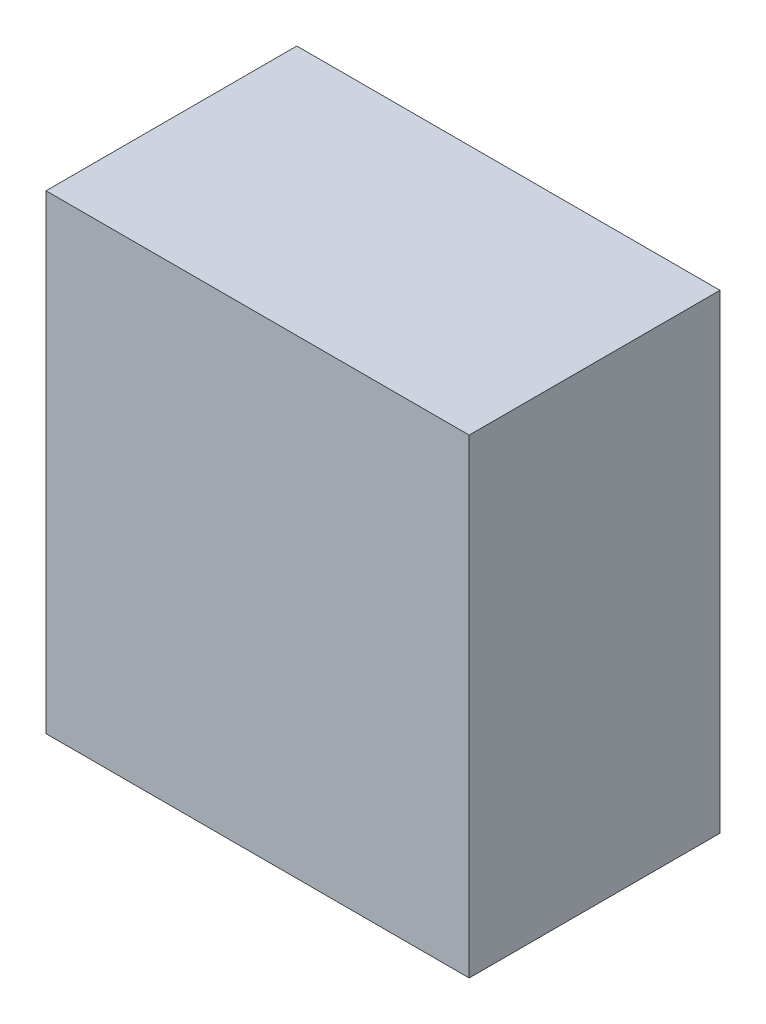
ISO-10303-21;
HEADER;
FILE_DESCRIPTION(('STEP AP214'),'2;1');
FILE_NAME('part.step','',(''),(''),'','','');
FILE_SCHEMA(('AUTOMOTIVE_DESIGN { 1 0 10303 214 1 1 1 1 }'));
ENDSEC;
DATA;
#1=APPLICATION_CONTEXT('core data for automotive mechanical design processes');
#2=APPLICATION_PROTOCOL_DEFINITION('international standard','automotive_design',2000,#1);
#3=PRODUCT_CONTEXT('',#1,'mechanical');
#4=PRODUCT('Part','Part','',(#3));
#5=PRODUCT_RELATED_PRODUCT_CATEGORY('part','',(#4));
#6=PRODUCT_DEFINITION_FORMATION('','',#4);
#7=PRODUCT_DEFINITION_CONTEXT('part definition',#1,'design');
#8=PRODUCT_DEFINITION('design','',#6,#7);
#9=PRODUCT_DEFINITION_SHAPE('','',#8);
#10=(LENGTH_UNIT() NAMED_UNIT(*) SI_UNIT(.MILLI.,.METRE.));
#11=(NAMED_UNIT(*) PLANE_ANGLE_UNIT() SI_UNIT($,.RADIAN.));
#12=(NAMED_UNIT(*) SI_UNIT($,.STERADIAN.) SOLID_ANGLE_UNIT());
#13=UNCERTAINTY_MEASURE_WITH_UNIT(LENGTH_MEASURE(1.E-05),#10,'distance_accuracy_value','');
#14=(GEOMETRIC_REPRESENTATION_CONTEXT(3) GLOBAL_UNCERTAINTY_ASSIGNED_CONTEXT((#13)) GLOBAL_UNIT_ASSIGNED_CONTEXT((#10,
#11,#12)) REPRESENTATION_CONTEXT('',''));
#15=CARTESIAN_POINT('',(0.,0.,0.));
#16=DIRECTION('',(0.,0.,1.));
#17=DIRECTION('',(1.,0.,0.));
#18=AXIS2_PLACEMENT_3D('',#15,#16,#17);
#19=CARTESIAN_POINT('',(2.7,6.,1.6));
#20=DIRECTION('',(-1.,0.,0.));
#21=DIRECTION('',(0.,0.,1.));
#22=AXIS2_PLACEMENT_3D('',#19,#20,#21);
#23=PLANE('',#22);
#24=DIRECTION('',(0.,0.,-1.));
#25=VECTOR('',#24,1.);
#26=CARTESIAN_POINT('',(2.7,0.,1.6));
#27=LINE('',#26,#25);
#28=CARTESIAN_POINT('',(2.7,0.,1.6));
#29=VERTEX_POINT('',#28);
#30=CARTESIAN_POINT('',(2.7,0.,-1.6));
#31=VERTEX_POINT('',#30);
#32=EDGE_CURVE('E97',#29,#31,#27,.T.);
#33=ORIENTED_EDGE('',*,*,#32,.T.);
#34=DIRECTION('',(0.,-1.,0.));
#35=VECTOR('',#34,1.);
#36=CARTESIAN_POINT('',(2.7,6.,-1.6));
#37=LINE('',#36,#35);
#38=CARTESIAN_POINT('',(2.7,6.,-1.6));
#39=VERTEX_POINT('',#38);
#40=EDGE_CURVE('E11',#39,#31,#37,.T.);
#41=ORIENTED_EDGE('',*,*,#40,.F.);
#42=DIRECTION('',(0.,0.,-1.));
#43=VECTOR('',#42,1.);
#44=CARTESIAN_POINT('',(2.7,6.,1.6));
#45=LINE('',#44,#43);
#46=CARTESIAN_POINT('',(2.7,6.,1.6));
#47=VERTEX_POINT('',#46);
#48=EDGE_CURVE('E85',#47,#39,#45,.T.);
#49=ORIENTED_EDGE('',*,*,#48,.F.);
#50=DIRECTION('',(0.,-1.,0.));
#51=VECTOR('',#50,1.);
#52=CARTESIAN_POINT('',(2.7,6.,1.6));
#53=LINE('',#52,#51);
#54=EDGE_CURVE('E93',#47,#29,#53,.T.);
#55=ORIENTED_EDGE('',*,*,#54,.T.);
#56=EDGE_LOOP('',(#33,#41,#49,#55));
#57=FACE_BOUND('',#56,.T.);
#58=ADVANCED_FACE('F34',(#57),#23,.F.);
#59=CARTESIAN_POINT('',(-2.7,6.,-1.6));
#60=DIRECTION('',(0.,0.,1.));
#61=DIRECTION('',(1.,0.,0.));
#62=AXIS2_PLACEMENT_3D('',#59,#60,#61);
#63=PLANE('',#62);
#64=DIRECTION('',(-1.,0.,0.));
#65=VECTOR('',#64,1.);
#66=CARTESIAN_POINT('',(-2.7,0.,-1.6));
#67=LINE('',#66,#65);
#68=CARTESIAN_POINT('',(-2.7,0.,-1.6));
#69=VERTEX_POINT('',#68);
#70=EDGE_CURVE('E89',#31,#69,#67,.T.);
#71=ORIENTED_EDGE('',*,*,#70,.T.);
#72=DIRECTION('',(0.,-1.,0.));
#73=VECTOR('',#72,1.);
#74=CARTESIAN_POINT('',(-2.7,6.,-1.6));
#75=LINE('',#74,#73);
#76=CARTESIAN_POINT('',(-2.7,6.,-1.6));
#77=VERTEX_POINT('',#76);
#78=EDGE_CURVE('E42',#77,#69,#75,.T.);
#79=ORIENTED_EDGE('',*,*,#78,.F.);
#80=DIRECTION('',(-1.,0.,0.));
#81=VECTOR('',#80,1.);
#82=CARTESIAN_POINT('',(-2.7,6.,-1.6));
#83=LINE('',#82,#81);
#84=EDGE_CURVE('E80',#39,#77,#83,.T.);
#85=ORIENTED_EDGE('',*,*,#84,.F.);
#86=ORIENTED_EDGE('',*,*,#40,.T.);
#87=EDGE_LOOP('',(#71,#79,#85,#86));
#88=FACE_BOUND('',#87,.T.);
#89=ADVANCED_FACE('F88',(#88),#63,.F.);
#90=CARTESIAN_POINT('',(-2.7,6.,1.6));
#91=DIRECTION('',(1.,0.,0.));
#92=DIRECTION('',(0.,0.,-1.));
#93=AXIS2_PLACEMENT_3D('',#90,#91,#92);
#94=PLANE('',#93);
#95=DIRECTION('',(0.,0.,1.));
#96=VECTOR('',#95,1.);
#97=CARTESIAN_POINT('',(-2.7,0.,1.6));
#98=LINE('',#97,#96);
#99=CARTESIAN_POINT('',(-2.7,0.,1.6));
#100=VERTEX_POINT('',#99);
#101=EDGE_CURVE('E67',#69,#100,#98,.T.);
#102=ORIENTED_EDGE('',*,*,#101,.T.);
#103=DIRECTION('',(0.,-1.,0.));
#104=VECTOR('',#103,1.);
#105=CARTESIAN_POINT('',(-2.7,6.,1.6));
#106=LINE('',#105,#104);
#107=CARTESIAN_POINT('',(-2.7,6.,1.6));
#108=VERTEX_POINT('',#107);
#109=EDGE_CURVE('E90',#108,#100,#106,.T.);
#110=ORIENTED_EDGE('',*,*,#109,.F.);
#111=DIRECTION('',(0.,0.,1.));
#112=VECTOR('',#111,1.);
#113=CARTESIAN_POINT('',(-2.7,6.,1.6));
#114=LINE('',#113,#112);
#115=EDGE_CURVE('E83',#77,#108,#114,.T.);
#116=ORIENTED_EDGE('',*,*,#115,.F.);
#117=ORIENTED_EDGE('',*,*,#78,.T.);
#118=EDGE_LOOP('',(#102,#110,#116,#117));
#119=FACE_BOUND('',#118,.T.);
#120=ADVANCED_FACE('F91',(#119),#94,.F.);
#121=CARTESIAN_POINT('',(-2.7,6.,1.6));
#122=DIRECTION('',(0.,0.,-1.));
#123=DIRECTION('',(-1.,0.,0.));
#124=AXIS2_PLACEMENT_3D('',#121,#122,#123);
#125=PLANE('',#124);
#126=DIRECTION('',(1.,0.,0.));
#127=VECTOR('',#126,1.);
#128=CARTESIAN_POINT('',(-2.7,0.,1.6));
#129=LINE('',#128,#127);
#130=EDGE_CURVE('E73',#100,#29,#129,.T.);
#131=ORIENTED_EDGE('',*,*,#130,.T.);
#132=ORIENTED_EDGE('',*,*,#54,.F.);
#133=DIRECTION('',(1.,0.,0.));
#134=VECTOR('',#133,1.);
#135=CARTESIAN_POINT('',(-2.7,6.,1.6));
#136=LINE('',#135,#134);
#137=EDGE_CURVE('E50',#108,#47,#136,.T.);
#138=ORIENTED_EDGE('',*,*,#137,.F.);
#139=ORIENTED_EDGE('',*,*,#109,.T.);
#140=EDGE_LOOP('',(#131,#132,#138,#139));
#141=FACE_BOUND('',#140,.T.);
#142=ADVANCED_FACE('F104',(#141),#125,.F.);
#143=CARTESIAN_POINT('',(0.,6.,0.));
#144=DIRECTION('',(0.,-1.,0.));
#145=DIRECTION('',(0.,0.,-1.));
#146=AXIS2_PLACEMENT_3D('',#143,#144,#145);
#147=PLANE('',#146);
#148=ORIENTED_EDGE('',*,*,#48,.T.);
#149=ORIENTED_EDGE('',*,*,#84,.T.);
#150=ORIENTED_EDGE('',*,*,#115,.T.);
#151=ORIENTED_EDGE('',*,*,#137,.T.);
#152=EDGE_LOOP('',(#148,#149,#150,#151));
#153=FACE_BOUND('',#152,.T.);
#154=ADVANCED_FACE('F81',(#153),#147,.F.);
#155=CARTESIAN_POINT('',(0.,0.,0.));
#156=DIRECTION('',(0.,-1.,0.));
#157=DIRECTION('',(0.,0.,-1.));
#158=AXIS2_PLACEMENT_3D('',#155,#156,#157);
#159=PLANE('',#158);
#160=ORIENTED_EDGE('',*,*,#32,.F.);
#161=ORIENTED_EDGE('',*,*,#130,.F.);
#162=ORIENTED_EDGE('',*,*,#101,.F.);
#163=ORIENTED_EDGE('',*,*,#70,.F.);
#164=EDGE_LOOP('',(#160,#161,#162,#163));
#165=FACE_BOUND('',#164,.T.);
#166=ADVANCED_FACE('F107',(#165),#159,.T.);
#167=CLOSED_SHELL('',(#58,#89,#120,#142,#154,#166));
#168=MANIFOLD_SOLID_BREP('B2',#167);
#169=ADVANCED_BREP_SHAPE_REPRESENTATION('',(#18,#168),#14);
#170=SHAPE_DEFINITION_REPRESENTATION(#9,#169);
ENDSEC;
END-ISO-10303-21;
